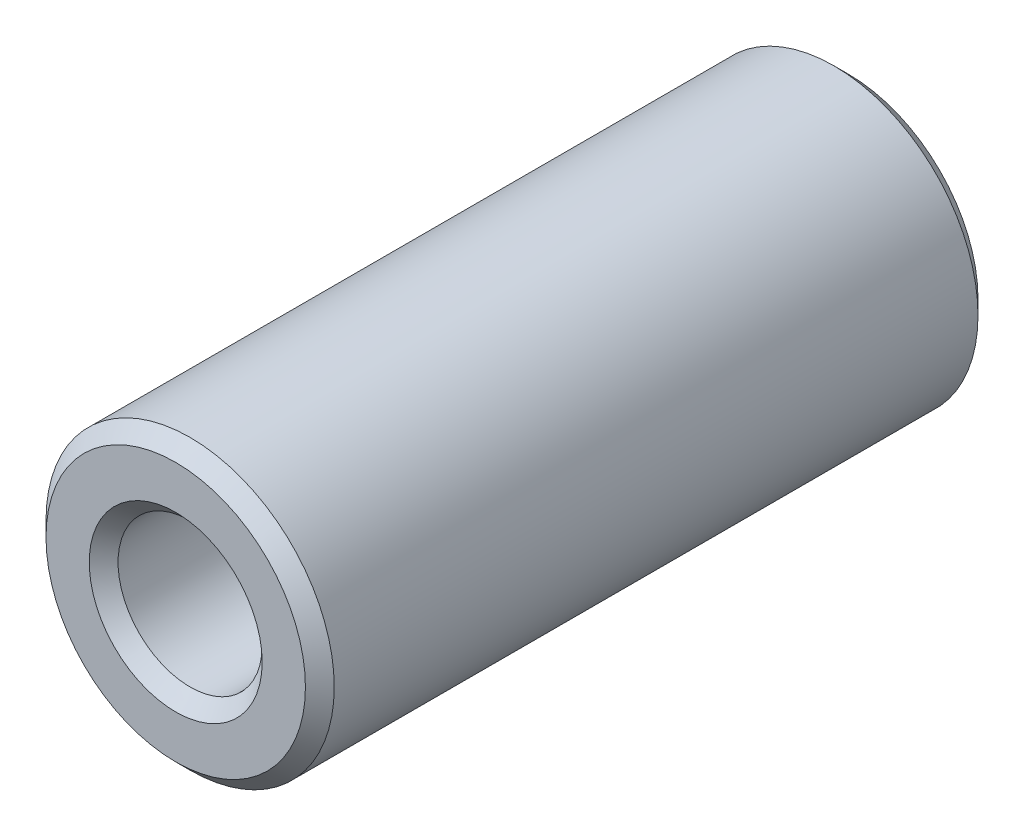
ISO-10303-21;
HEADER;
FILE_DESCRIPTION(('STEP AP214'),'2;1');
FILE_NAME('part.step','',(''),(''),'','','');
FILE_SCHEMA(('AUTOMOTIVE_DESIGN { 1 0 10303 214 1 1 1 1 }'));
ENDSEC;
DATA;
#1=APPLICATION_CONTEXT('core data for automotive mechanical design processes');
#2=APPLICATION_PROTOCOL_DEFINITION('international standard','automotive_design',2000,#1);
#3=PRODUCT_CONTEXT('',#1,'mechanical');
#4=PRODUCT('Part','Part','',(#3));
#5=PRODUCT_RELATED_PRODUCT_CATEGORY('part','',(#4));
#6=PRODUCT_DEFINITION_FORMATION('','',#4);
#7=PRODUCT_DEFINITION_CONTEXT('part definition',#1,'design');
#8=PRODUCT_DEFINITION('design','',#6,#7);
#9=PRODUCT_DEFINITION_SHAPE('','',#8);
#10=(LENGTH_UNIT() NAMED_UNIT(*) SI_UNIT(.MILLI.,.METRE.));
#11=(NAMED_UNIT(*) PLANE_ANGLE_UNIT() SI_UNIT($,.RADIAN.));
#12=(NAMED_UNIT(*) SI_UNIT($,.STERADIAN.) SOLID_ANGLE_UNIT());
#13=UNCERTAINTY_MEASURE_WITH_UNIT(LENGTH_MEASURE(1.E-05),#10,'distance_accuracy_value','');
#14=(GEOMETRIC_REPRESENTATION_CONTEXT(3) GLOBAL_UNCERTAINTY_ASSIGNED_CONTEXT((#13)) GLOBAL_UNIT_ASSIGNED_CONTEXT((#10,
#11,#12)) REPRESENTATION_CONTEXT('',''));
#15=CARTESIAN_POINT('',(0.,0.,0.));
#16=DIRECTION('',(0.,0.,1.));
#17=DIRECTION('',(1.,0.,0.));
#18=AXIS2_PLACEMENT_3D('',#15,#16,#17);
#19=CARTESIAN_POINT('',(0.,0.,14.));
#20=DIRECTION('',(0.,0.,1.));
#21=DIRECTION('',(1.,0.,0.));
#22=AXIS2_PLACEMENT_3D('',#19,#20,#21);
#23=PLANE('',#22);
#24=CARTESIAN_POINT('',(0.,0.,14.));
#25=DIRECTION('',(0.,0.,1.));
#26=DIRECTION('',(1.,0.,0.));
#27=AXIS2_PLACEMENT_3D('',#24,#25,#26);
#28=CIRCLE('',#27,1.8);
#29=CARTESIAN_POINT('',(1.8,0.,14.));
#30=VERTEX_POINT('',#29);
#31=EDGE_CURVE('E10',#30,#30,#28,.F.);
#32=ORIENTED_EDGE('',*,*,#31,.T.);
#33=EDGE_LOOP('',(#32));
#34=FACE_BOUND('',#33,.T.);
#35=CARTESIAN_POINT('',(0.,0.,14.));
#36=DIRECTION('',(0.,0.,1.));
#37=DIRECTION('',(1.,0.,0.));
#38=AXIS2_PLACEMENT_3D('',#35,#36,#37);
#39=CIRCLE('',#38,2.7);
#40=CARTESIAN_POINT('',(2.7,0.,14.));
#41=VERTEX_POINT('',#40);
#42=EDGE_CURVE('E37',#41,#41,#39,.T.);
#43=ORIENTED_EDGE('',*,*,#42,.T.);
#44=EDGE_LOOP('',(#43));
#45=FACE_BOUND('',#44,.T.);
#46=ADVANCED_FACE('F30',(#34,#45),#23,.T.);
#47=CARTESIAN_POINT('',(0.,0.,0.));
#48=DIRECTION('',(0.,0.,1.));
#49=DIRECTION('',(1.,0.,0.));
#50=AXIS2_PLACEMENT_3D('',#47,#48,#49);
#51=PLANE('',#50);
#52=CARTESIAN_POINT('',(0.,0.,0.));
#53=DIRECTION('',(0.,0.,1.));
#54=DIRECTION('',(1.,0.,0.));
#55=AXIS2_PLACEMENT_3D('',#52,#53,#54);
#56=CIRCLE('',#55,1.8);
#57=CARTESIAN_POINT('',(1.8,0.,0.));
#58=VERTEX_POINT('',#57);
#59=EDGE_CURVE('E56',#58,#58,#56,.T.);
#60=ORIENTED_EDGE('',*,*,#59,.T.);
#61=EDGE_LOOP('',(#60));
#62=FACE_BOUND('',#61,.T.);
#63=CARTESIAN_POINT('',(0.,0.,0.));
#64=DIRECTION('',(0.,0.,1.));
#65=DIRECTION('',(1.,0.,0.));
#66=AXIS2_PLACEMENT_3D('',#63,#64,#65);
#67=CIRCLE('',#66,2.7);
#68=CARTESIAN_POINT('',(2.7,0.,0.));
#69=VERTEX_POINT('',#68);
#70=EDGE_CURVE('E59',#69,#69,#67,.F.);
#71=ORIENTED_EDGE('',*,*,#70,.T.);
#72=EDGE_LOOP('',(#71));
#73=FACE_BOUND('',#72,.T.);
#74=ADVANCED_FACE('F63',(#62,#73),#51,.F.);
#75=CARTESIAN_POINT('',(0.,0.,14.));
#76=DIRECTION('',(0.,0.,-1.));
#77=DIRECTION('',(-1.,0.,0.));
#78=AXIS2_PLACEMENT_3D('',#75,#76,#77);
#79=CYLINDRICAL_SURFACE('',#78,3.);
#80=CARTESIAN_POINT('',(0.,0.,0.299999999999998));
#81=DIRECTION('',(0.,0.,1.));
#82=DIRECTION('',(1.,0.,0.));
#83=AXIS2_PLACEMENT_3D('',#80,#81,#82);
#84=CIRCLE('',#83,3.);
#85=CARTESIAN_POINT('',(3.,0.,0.299999999999998));
#86=VERTEX_POINT('',#85);
#87=EDGE_CURVE('E41',#86,#86,#84,.T.);
#88=ORIENTED_EDGE('',*,*,#87,.T.);
#89=EDGE_LOOP('',(#88));
#90=FACE_BOUND('',#89,.T.);
#91=CARTESIAN_POINT('',(0.,0.,13.7));
#92=DIRECTION('',(0.,0.,1.));
#93=DIRECTION('',(1.,0.,0.));
#94=AXIS2_PLACEMENT_3D('',#91,#92,#93);
#95=CIRCLE('',#94,3.);
#96=CARTESIAN_POINT('',(3.,0.,13.7));
#97=VERTEX_POINT('',#96);
#98=EDGE_CURVE('E45',#97,#97,#95,.F.);
#99=ORIENTED_EDGE('',*,*,#98,.T.);
#100=EDGE_LOOP('',(#99));
#101=FACE_BOUND('',#100,.T.);
#102=ADVANCED_FACE('F73',(#90,#101),#79,.T.);
#103=CARTESIAN_POINT('',(0.,0.,14.));
#104=DIRECTION('',(0.,0.,-1.));
#105=DIRECTION('',(-1.,0.,0.));
#106=AXIS2_PLACEMENT_3D('',#103,#104,#105);
#107=CYLINDRICAL_SURFACE('',#106,1.5);
#108=CARTESIAN_POINT('',(0.,0.,0.3));
#109=DIRECTION('',(0.,0.,1.));
#110=DIRECTION('',(1.,0.,0.));
#111=AXIS2_PLACEMENT_3D('',#108,#109,#110);
#112=CIRCLE('',#111,1.5);
#113=CARTESIAN_POINT('',(1.5,0.,0.3));
#114=VERTEX_POINT('',#113);
#115=EDGE_CURVE('E50',#114,#114,#112,.F.);
#116=ORIENTED_EDGE('',*,*,#115,.T.);
#117=EDGE_LOOP('',(#116));
#118=FACE_BOUND('',#117,.T.);
#119=CARTESIAN_POINT('',(0.,0.,13.7));
#120=DIRECTION('',(0.,0.,1.));
#121=DIRECTION('',(1.,0.,0.));
#122=AXIS2_PLACEMENT_3D('',#119,#120,#121);
#123=CIRCLE('',#122,1.5);
#124=CARTESIAN_POINT('',(1.5,0.,13.7));
#125=VERTEX_POINT('',#124);
#126=EDGE_CURVE('E53',#125,#125,#123,.T.);
#127=ORIENTED_EDGE('',*,*,#126,.T.);
#128=EDGE_LOOP('',(#127));
#129=FACE_BOUND('',#128,.T.);
#130=ADVANCED_FACE('F76',(#118,#129),#107,.F.);
#131=CARTESIAN_POINT('',(0.,0.,0.));
#132=DIRECTION('',(0.,0.,-1.));
#133=DIRECTION('',(-1.,0.,0.));
#134=AXIS2_PLACEMENT_3D('',#131,#132,#133);
#135=CONICAL_SURFACE('',#134,1.8,0.78539816339745);
#136=ORIENTED_EDGE('',*,*,#115,.F.);
#137=EDGE_LOOP('',(#136));
#138=FACE_BOUND('',#137,.T.);
#139=ORIENTED_EDGE('',*,*,#59,.F.);
#140=EDGE_LOOP('',(#139));
#141=FACE_BOUND('',#140,.T.);
#142=ADVANCED_FACE('F69',(#138,#141),#135,.F.);
#143=CARTESIAN_POINT('',(0.,0.,0.299999999999998));
#144=DIRECTION('',(0.,0.,1.));
#145=DIRECTION('',(1.,0.,0.));
#146=AXIS2_PLACEMENT_3D('',#143,#144,#145);
#147=CONICAL_SURFACE('',#146,3.,0.78539816339745);
#148=ORIENTED_EDGE('',*,*,#70,.F.);
#149=EDGE_LOOP('',(#148));
#150=FACE_BOUND('',#149,.T.);
#151=ORIENTED_EDGE('',*,*,#87,.F.);
#152=EDGE_LOOP('',(#151));
#153=FACE_BOUND('',#152,.T.);
#154=ADVANCED_FACE('F65',(#150,#153),#147,.T.);
#155=CARTESIAN_POINT('',(0.,0.,13.7));
#156=DIRECTION('',(0.,0.,1.));
#157=DIRECTION('',(1.,0.,0.));
#158=AXIS2_PLACEMENT_3D('',#155,#156,#157);
#159=CONICAL_SURFACE('',#158,1.5,0.78539816339745);
#160=ORIENTED_EDGE('',*,*,#31,.F.);
#161=EDGE_LOOP('',(#160));
#162=FACE_BOUND('',#161,.T.);
#163=ORIENTED_EDGE('',*,*,#126,.F.);
#164=EDGE_LOOP('',(#163));
#165=FACE_BOUND('',#164,.T.);
#166=ADVANCED_FACE('F68',(#162,#165),#159,.F.);
#167=CARTESIAN_POINT('',(0.,0.,14.));
#168=DIRECTION('',(0.,0.,-1.));
#169=DIRECTION('',(-1.,0.,0.));
#170=AXIS2_PLACEMENT_3D('',#167,#168,#169);
#171=CONICAL_SURFACE('',#170,2.7,0.78539816339745);
#172=ORIENTED_EDGE('',*,*,#98,.F.);
#173=EDGE_LOOP('',(#172));
#174=FACE_BOUND('',#173,.T.);
#175=ORIENTED_EDGE('',*,*,#42,.F.);
#176=EDGE_LOOP('',(#175));
#177=FACE_BOUND('',#176,.T.);
#178=ADVANCED_FACE('F32',(#174,#177),#171,.T.);
#179=CLOSED_SHELL('',(#46,#74,#102,#130,#142,#154,#166,#178));
#180=MANIFOLD_SOLID_BREP('B2',#179);
#181=ADVANCED_BREP_SHAPE_REPRESENTATION('',(#18,#180),#14);
#182=SHAPE_DEFINITION_REPRESENTATION(#9,#181);
ENDSEC;
END-ISO-10303-21;
